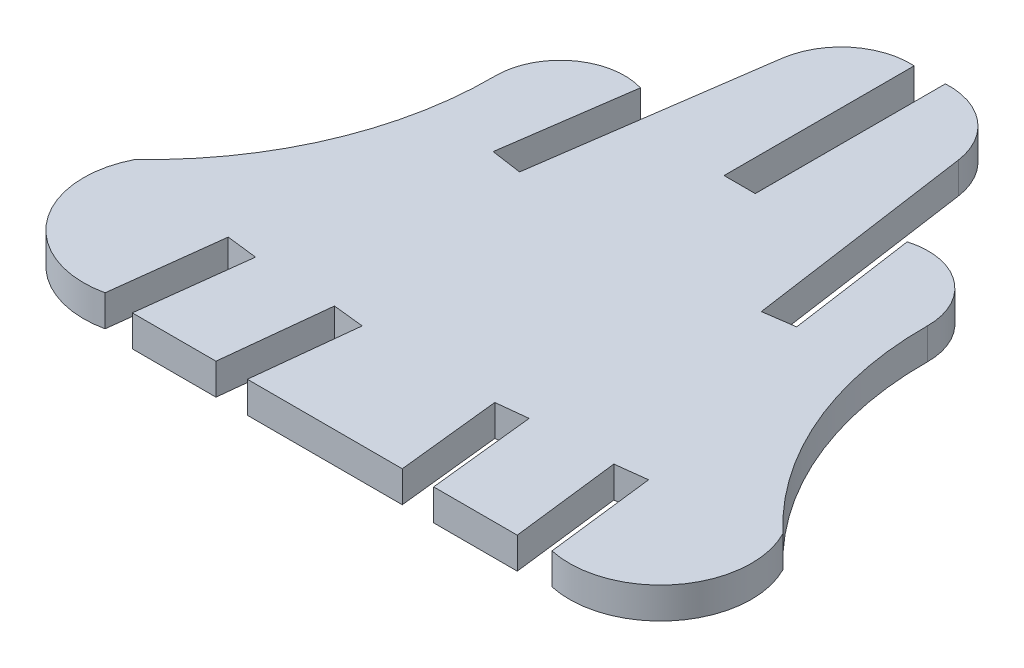
ISO-10303-21;
HEADER;
FILE_DESCRIPTION(('STEP AP214'),'2;1');
FILE_NAME('part.step','',(''),(''),'','','');
FILE_SCHEMA(('AUTOMOTIVE_DESIGN { 1 0 10303 214 1 1 1 1 }'));
ENDSEC;
DATA;
#1=APPLICATION_CONTEXT('core data for automotive mechanical design processes');
#2=APPLICATION_PROTOCOL_DEFINITION('international standard','automotive_design',2000,#1);
#3=PRODUCT_CONTEXT('',#1,'mechanical');
#4=PRODUCT('Part','Part','',(#3));
#5=PRODUCT_RELATED_PRODUCT_CATEGORY('part','',(#4));
#6=PRODUCT_DEFINITION_FORMATION('','',#4);
#7=PRODUCT_DEFINITION_CONTEXT('part definition',#1,'design');
#8=PRODUCT_DEFINITION('design','',#6,#7);
#9=PRODUCT_DEFINITION_SHAPE('','',#8);
#10=(LENGTH_UNIT() NAMED_UNIT(*) SI_UNIT(.MILLI.,.METRE.));
#11=(NAMED_UNIT(*) PLANE_ANGLE_UNIT() SI_UNIT($,.RADIAN.));
#12=(NAMED_UNIT(*) SI_UNIT($,.STERADIAN.) SOLID_ANGLE_UNIT());
#13=UNCERTAINTY_MEASURE_WITH_UNIT(LENGTH_MEASURE(1.E-05),#10,'distance_accuracy_value','');
#14=(GEOMETRIC_REPRESENTATION_CONTEXT(3) GLOBAL_UNCERTAINTY_ASSIGNED_CONTEXT((#13)) GLOBAL_UNIT_ASSIGNED_CONTEXT((#10,
#11,#12)) REPRESENTATION_CONTEXT('',''));
#15=CARTESIAN_POINT('',(0.,0.,0.));
#16=DIRECTION('',(0.,0.,1.));
#17=DIRECTION('',(1.,0.,0.));
#18=AXIS2_PLACEMENT_3D('',#15,#16,#17);
#19=CARTESIAN_POINT('',(-42106.1875,3.,-18178.298828));
#20=DIRECTION('',(-0.992772256153152,0.,0.120013530122983));
#21=DIRECTION('',(0.120013530122983,0.,0.992772256153152));
#22=AXIS2_PLACEMENT_3D('',#19,#20,#21);
#23=PLANE('',#22);
#24=DIRECTION('',(-0.120013530122983,0.,-0.992772256153152));
#25=VECTOR('',#24,1.);
#26=CARTESIAN_POINT('',(-42106.1875,0.,-18178.298828));
#27=LINE('',#26,#25);
#28=CARTESIAN_POINT('',(-42104.910156,0.,-18167.732422));
#29=VERTEX_POINT('',#28);
#30=CARTESIAN_POINT('',(-42106.1875,0.,-18178.298828));
#31=VERTEX_POINT('',#30);
#32=EDGE_CURVE('E275',#29,#31,#27,.T.);
#33=ORIENTED_EDGE('',*,*,#32,.T.);
#34=DIRECTION('',(0.,-1.,0.));
#35=VECTOR('',#34,1.);
#36=CARTESIAN_POINT('',(-42106.1875,3.,-18178.298828));
#37=LINE('',#36,#35);
#38=CARTESIAN_POINT('',(-42106.1875,3.,-18178.298828));
#39=VERTEX_POINT('',#38);
#40=EDGE_CURVE('E11',#39,#31,#37,.T.);
#41=ORIENTED_EDGE('',*,*,#40,.F.);
#42=DIRECTION('',(-0.120013530122983,0.,-0.992772256153152));
#43=VECTOR('',#42,1.);
#44=CARTESIAN_POINT('',(-42106.1875,3.,-18178.298828));
#45=LINE('',#44,#43);
#46=CARTESIAN_POINT('',(-42104.910156,3.,-18167.732422));
#47=VERTEX_POINT('',#46);
#48=EDGE_CURVE('E337',#47,#39,#45,.T.);
#49=ORIENTED_EDGE('',*,*,#48,.F.);
#50=DIRECTION('',(0.,-1.,0.));
#51=VECTOR('',#50,1.);
#52=CARTESIAN_POINT('',(-42104.910156,3.,-18167.732422));
#53=LINE('',#52,#51);
#54=EDGE_CURVE('E271',#47,#29,#53,.T.);
#55=ORIENTED_EDGE('',*,*,#54,.T.);
#56=EDGE_LOOP('',(#33,#41,#49,#55));
#57=FACE_BOUND('',#56,.T.);
#58=ADVANCED_FACE('F35',(#57),#23,.F.);
#59=CARTESIAN_POINT('',(-42103.207031,3.,-18178.660156));
#60=DIRECTION('',(-0.120350744552578,0.,-0.992731433110506));
#61=DIRECTION('',(-0.992731433110507,0.,0.120350744552578));
#62=AXIS2_PLACEMENT_3D('',#59,#60,#61);
#63=PLANE('',#62);
#64=DIRECTION('',(0.992731433110507,0.,-0.120350744552578));
#65=VECTOR('',#64,1.);
#66=CARTESIAN_POINT('',(-42103.207031,0.,-18178.660156));
#67=LINE('',#66,#65);
#68=CARTESIAN_POINT('',(-42103.207031,0.,-18178.660156));
#69=VERTEX_POINT('',#68);
#70=EDGE_CURVE('E278',#31,#69,#67,.T.);
#71=ORIENTED_EDGE('',*,*,#70,.T.);
#72=DIRECTION('',(0.,-1.,0.));
#73=VECTOR('',#72,1.);
#74=CARTESIAN_POINT('',(-42103.207031,3.,-18178.660156));
#75=LINE('',#74,#73);
#76=CARTESIAN_POINT('',(-42103.207031,3.,-18178.660156));
#77=VERTEX_POINT('',#76);
#78=EDGE_CURVE('E43',#77,#69,#75,.T.);
#79=ORIENTED_EDGE('',*,*,#78,.F.);
#80=DIRECTION('',(0.992731433110507,0.,-0.120350744552578));
#81=VECTOR('',#80,1.);
#82=CARTESIAN_POINT('',(-42103.207031,3.,-18178.660156));
#83=LINE('',#82,#81);
#84=EDGE_CURVE('E166',#39,#77,#83,.T.);
#85=ORIENTED_EDGE('',*,*,#84,.F.);
#86=ORIENTED_EDGE('',*,*,#40,.T.);
#87=EDGE_LOOP('',(#71,#79,#85,#86));
#88=FACE_BOUND('',#87,.T.);
#89=ADVANCED_FACE('F515',(#88),#63,.F.);
#90=CARTESIAN_POINT('',(-42101.930163,3.,-18168.091132));
#91=DIRECTION('',(0.992781122721639,0.,-0.119940161612204));
#92=DIRECTION('',(-0.119940161612204,0.,-0.992781122721639));
#93=AXIS2_PLACEMENT_3D('',#90,#91,#92);
#94=PLANE('',#93);
#95=DIRECTION('',(0.119940161612204,0.,0.992781122721639));
#96=VECTOR('',#95,1.);
#97=CARTESIAN_POINT('',(-42101.930163,0.,-18168.091132));
#98=LINE('',#97,#96);
#99=CARTESIAN_POINT('',(-42101.930163,0.,-18168.091132));
#100=VERTEX_POINT('',#99);
#101=EDGE_CURVE('E280',#69,#100,#98,.T.);
#102=ORIENTED_EDGE('',*,*,#101,.T.);
#103=DIRECTION('',(0.,-1.,0.));
#104=VECTOR('',#103,1.);
#105=CARTESIAN_POINT('',(-42101.930163,3.,-18168.091132));
#106=LINE('',#105,#104);
#107=CARTESIAN_POINT('',(-42101.930163,3.,-18168.091132));
#108=VERTEX_POINT('',#107);
#109=EDGE_CURVE('E416',#108,#100,#106,.T.);
#110=ORIENTED_EDGE('',*,*,#109,.F.);
#111=DIRECTION('',(0.119940161612204,0.,0.992781122721639));
#112=VECTOR('',#111,1.);
#113=CARTESIAN_POINT('',(-42101.930163,3.,-18168.091132));
#114=LINE('',#113,#112);
#115=EDGE_CURVE('E424',#77,#108,#114,.T.);
#116=ORIENTED_EDGE('',*,*,#115,.F.);
#117=ORIENTED_EDGE('',*,*,#78,.T.);
#118=EDGE_LOOP('',(#102,#110,#116,#117));
#119=FACE_BOUND('',#118,.T.);
#120=ADVANCED_FACE('F422',(#119),#94,.F.);
#121=CARTESIAN_POINT('',(-42100.0576006114,3.,-18176.6497267105));
#122=DIRECTION('',(0.,-1.,0.));
#123=DIRECTION('',(0.,0.,-1.));
#124=AXIS2_PLACEMENT_3D('',#121,#122,#123);
#125=CYLINDRICAL_SURFACE('',#124,8.76105206681195);
#126=CARTESIAN_POINT('',(-42100.0576006114,0.,-18176.6497267105));
#127=DIRECTION('',(0.,1.,0.));
#128=DIRECTION('',(0.,0.,1.));
#129=AXIS2_PLACEMENT_3D('',#126,#127,#128);
#130=CIRCLE('',#129,8.76105206681195);
#131=CARTESIAN_POINT('',(-42092.260597,0.,-18180.64507));
#132=VERTEX_POINT('',#131);
#133=EDGE_CURVE('E282',#100,#132,#130,.T.);
#134=ORIENTED_EDGE('',*,*,#133,.T.);
#135=DIRECTION('',(0.,-1.,0.));
#136=VECTOR('',#135,1.);
#137=CARTESIAN_POINT('',(-42092.260597,3.,-18180.64507));
#138=LINE('',#137,#136);
#139=CARTESIAN_POINT('',(-42092.260597,3.,-18180.64507));
#140=VERTEX_POINT('',#139);
#141=EDGE_CURVE('E413',#140,#132,#138,.T.);
#142=ORIENTED_EDGE('',*,*,#141,.F.);
#143=CARTESIAN_POINT('',(-42100.0576006114,3.,-18176.6497267105));
#144=DIRECTION('',(0.,1.,0.));
#145=DIRECTION('',(0.,0.,1.));
#146=AXIS2_PLACEMENT_3D('',#143,#144,#145);
#147=CIRCLE('',#146,8.76105206681195);
#148=EDGE_CURVE('E442',#108,#140,#147,.T.);
#149=ORIENTED_EDGE('',*,*,#148,.F.);
#150=ORIENTED_EDGE('',*,*,#109,.T.);
#151=EDGE_LOOP('',(#134,#142,#149,#150));
#152=FACE_BOUND('',#151,.T.);
#153=ADVANCED_FACE('F433',(#152),#125,.T.);
#154=CARTESIAN_POINT('',(-42069.653546331,3.,-18204.6414887281));
#155=DIRECTION('',(0.,-1.,0.));
#156=DIRECTION('',(0.,0.,-1.));
#157=AXIS2_PLACEMENT_3D('',#154,#155,#156);
#158=CYLINDRICAL_SURFACE('',#157,32.9682703781003);
#159=CARTESIAN_POINT('',(-42069.653546331,0.,-18204.6414887281));
#160=DIRECTION('',(0.,-1.,0.));
#161=DIRECTION('',(0.,0.,1.));
#162=AXIS2_PLACEMENT_3D('',#159,#160,#161);
#163=CIRCLE('',#162,32.9682703781003);
#164=CARTESIAN_POINT('',(-42102.620675,0.,-18204.915859));
#165=VERTEX_POINT('',#164);
#166=EDGE_CURVE('E284',#132,#165,#163,.T.);
#167=ORIENTED_EDGE('',*,*,#166,.T.);
#168=DIRECTION('',(0.,-1.,0.));
#169=VECTOR('',#168,1.);
#170=CARTESIAN_POINT('',(-42102.620675,3.,-18204.915859));
#171=LINE('',#170,#169);
#172=CARTESIAN_POINT('',(-42102.620675,3.,-18204.915859));
#173=VERTEX_POINT('',#172);
#174=EDGE_CURVE('E410',#173,#165,#171,.T.);
#175=ORIENTED_EDGE('',*,*,#174,.F.);
#176=CARTESIAN_POINT('',(-42069.653546331,3.,-18204.6414887281));
#177=DIRECTION('',(0.,-1.,0.));
#178=DIRECTION('',(0.,0.,1.));
#179=AXIS2_PLACEMENT_3D('',#176,#177,#178);
#180=CIRCLE('',#179,32.9682703781003);
#181=EDGE_CURVE('E439',#140,#173,#180,.T.);
#182=ORIENTED_EDGE('',*,*,#181,.F.);
#183=ORIENTED_EDGE('',*,*,#141,.T.);
#184=EDGE_LOOP('',(#167,#175,#182,#183));
#185=FACE_BOUND('',#184,.T.);
#186=ADVANCED_FACE('F437',(#185),#158,.F.);
#187=CARTESIAN_POINT('',(-42108.8242526346,3.,-18204.966822316));
#188=DIRECTION('',(0.,-1.,0.));
#189=DIRECTION('',(0.,0.,-1.));
#190=AXIS2_PLACEMENT_3D('',#187,#188,#189);
#191=CYLINDRICAL_SURFACE('',#190,6.20378696669872);
#192=CARTESIAN_POINT('',(-42108.8242526346,0.,-18204.966822316));
#193=DIRECTION('',(0.,1.,0.));
#194=DIRECTION('',(0.,0.,1.));
#195=AXIS2_PLACEMENT_3D('',#192,#193,#194);
#196=CIRCLE('',#195,6.20378696669872);
#197=CARTESIAN_POINT('',(-42110.589844,0.,-18210.914062));
#198=VERTEX_POINT('',#197);
#199=EDGE_CURVE('E286',#165,#198,#196,.T.);
#200=ORIENTED_EDGE('',*,*,#199,.T.);
#201=DIRECTION('',(0.,-1.,0.));
#202=VECTOR('',#201,1.);
#203=CARTESIAN_POINT('',(-42110.589844,3.,-18210.914062));
#204=LINE('',#203,#202);
#205=CARTESIAN_POINT('',(-42110.589844,3.,-18210.914062));
#206=VERTEX_POINT('',#205);
#207=EDGE_CURVE('E407',#206,#198,#204,.T.);
#208=ORIENTED_EDGE('',*,*,#207,.F.);
#209=CARTESIAN_POINT('',(-42108.8242526346,3.,-18204.966822316));
#210=DIRECTION('',(0.,1.,0.));
#211=DIRECTION('',(0.,0.,1.));
#212=AXIS2_PLACEMENT_3D('',#209,#210,#211);
#213=CIRCLE('',#212,6.20378696669872);
#214=EDGE_CURVE('E441',#173,#206,#213,.T.);
#215=ORIENTED_EDGE('',*,*,#214,.F.);
#216=ORIENTED_EDGE('',*,*,#174,.T.);
#217=EDGE_LOOP('',(#200,#208,#215,#216));
#218=FACE_BOUND('',#217,.T.);
#219=ADVANCED_FACE('F528',(#218),#191,.T.);
#220=CARTESIAN_POINT('',(-42108.820312,3.,-18198.515625));
#221=DIRECTION('',(0.989968189775642,0.,-0.141290421587375));
#222=DIRECTION('',(-0.141290421587375,0.,-0.989968189775642));
#223=AXIS2_PLACEMENT_3D('',#220,#221,#222);
#224=PLANE('',#223);
#225=DIRECTION('',(0.141290421587375,0.,0.989968189775642));
#226=VECTOR('',#225,1.);
#227=CARTESIAN_POINT('',(-42108.820312,0.,-18198.515625));
#228=LINE('',#227,#226);
#229=CARTESIAN_POINT('',(-42108.820312,0.,-18198.515625));
#230=VERTEX_POINT('',#229);
#231=EDGE_CURVE('E288',#198,#230,#228,.T.);
#232=ORIENTED_EDGE('',*,*,#231,.T.);
#233=DIRECTION('',(0.,-1.,0.));
#234=VECTOR('',#233,1.);
#235=CARTESIAN_POINT('',(-42108.820312,3.,-18198.515625));
#236=LINE('',#235,#234);
#237=CARTESIAN_POINT('',(-42108.820312,3.,-18198.515625));
#238=VERTEX_POINT('',#237);
#239=EDGE_CURVE('E404',#238,#230,#236,.T.);
#240=ORIENTED_EDGE('',*,*,#239,.F.);
#241=DIRECTION('',(0.141290421587375,0.,0.989968189775642));
#242=VECTOR('',#241,1.);
#243=CARTESIAN_POINT('',(-42108.820312,3.,-18198.515625));
#244=LINE('',#243,#242);
#245=EDGE_CURVE('E444',#206,#238,#244,.T.);
#246=ORIENTED_EDGE('',*,*,#245,.F.);
#247=ORIENTED_EDGE('',*,*,#207,.T.);
#248=EDGE_LOOP('',(#232,#240,#246,#247));
#249=FACE_BOUND('',#248,.T.);
#250=ADVANCED_FACE('F531',(#249),#224,.F.);
#251=CARTESIAN_POINT('',(-42111.792969,3.,-18198.091797));
#252=DIRECTION('',(0.141148085161714,0.,0.989988493900399));
#253=DIRECTION('',(0.9899884939004,0.,-0.141148085161714));
#254=AXIS2_PLACEMENT_3D('',#251,#252,#253);
#255=PLANE('',#254);
#256=DIRECTION('',(-0.9899884939004,0.,0.141148085161714));
#257=VECTOR('',#256,1.);
#258=CARTESIAN_POINT('',(-42111.792969,0.,-18198.091797));
#259=LINE('',#258,#257);
#260=CARTESIAN_POINT('',(-42111.792969,0.,-18198.091797));
#261=VERTEX_POINT('',#260);
#262=EDGE_CURVE('E290',#230,#261,#259,.T.);
#263=ORIENTED_EDGE('',*,*,#262,.T.);
#264=DIRECTION('',(0.,-1.,0.));
#265=VECTOR('',#264,1.);
#266=CARTESIAN_POINT('',(-42111.792969,3.,-18198.091797));
#267=LINE('',#266,#265);
#268=CARTESIAN_POINT('',(-42111.792969,3.,-18198.091797));
#269=VERTEX_POINT('',#268);
#270=EDGE_CURVE('E401',#269,#261,#267,.T.);
#271=ORIENTED_EDGE('',*,*,#270,.F.);
#272=DIRECTION('',(-0.9899884939004,0.,0.141148085161714));
#273=VECTOR('',#272,1.);
#274=CARTESIAN_POINT('',(-42111.792969,3.,-18198.091797));
#275=LINE('',#274,#273);
#276=EDGE_CURVE('E450',#238,#269,#275,.T.);
#277=ORIENTED_EDGE('',*,*,#276,.F.);
#278=ORIENTED_EDGE('',*,*,#239,.T.);
#279=EDGE_LOOP('',(#263,#271,#277,#278));
#280=FACE_BOUND('',#279,.T.);
#281=ADVANCED_FACE('F535',(#280),#255,.F.);
#282=CARTESIAN_POINT('',(-42114.939322,3.,-18220.18568));
#283=DIRECTION('',(-0.990011603966922,0.,0.14098590004267));
#284=DIRECTION('',(0.14098590004267,0.,0.990011603966922));
#285=AXIS2_PLACEMENT_3D('',#282,#283,#284);
#286=PLANE('',#285);
#287=DIRECTION('',(-0.14098590004267,0.,-0.990011603966922));
#288=VECTOR('',#287,1.);
#289=CARTESIAN_POINT('',(-42114.939322,0.,-18220.18568));
#290=LINE('',#289,#288);
#291=CARTESIAN_POINT('',(-42114.939322,0.,-18220.18568));
#292=VERTEX_POINT('',#291);
#293=EDGE_CURVE('E292',#261,#292,#290,.T.);
#294=ORIENTED_EDGE('',*,*,#293,.T.);
#295=DIRECTION('',(0.,-1.,0.));
#296=VECTOR('',#295,1.);
#297=CARTESIAN_POINT('',(-42114.939322,3.,-18220.18568));
#298=LINE('',#297,#296);
#299=CARTESIAN_POINT('',(-42114.939322,3.,-18220.18568));
#300=VERTEX_POINT('',#299);
#301=EDGE_CURVE('E398',#300,#292,#298,.T.);
#302=ORIENTED_EDGE('',*,*,#301,.F.);
#303=DIRECTION('',(-0.14098590004267,0.,-0.990011603966922));
#304=VECTOR('',#303,1.);
#305=CARTESIAN_POINT('',(-42114.939322,3.,-18220.18568));
#306=LINE('',#305,#304);
#307=EDGE_CURVE('E452',#269,#300,#306,.T.);
#308=ORIENTED_EDGE('',*,*,#307,.F.);
#309=ORIENTED_EDGE('',*,*,#270,.T.);
#310=EDGE_LOOP('',(#294,#302,#308,#309));
#311=FACE_BOUND('',#310,.T.);
#312=ADVANCED_FACE('F539',(#311),#286,.F.);
#313=CARTESIAN_POINT('',(-42121.5517199728,3.,-18219.2449121822));
#314=DIRECTION('',(0.,-1.,0.));
#315=DIRECTION('',(0.,0.,-1.));
#316=AXIS2_PLACEMENT_3D('',#313,#314,#315);
#317=CYLINDRICAL_SURFACE('',#316,6.67898577910288);
#318=CARTESIAN_POINT('',(-42121.5517199728,0.,-18219.2449121822));
#319=DIRECTION('',(0.,1.,0.));
#320=DIRECTION('',(0.,0.,1.));
#321=AXIS2_PLACEMENT_3D('',#318,#319,#320);
#322=CIRCLE('',#321,6.67898577910288);
#323=CARTESIAN_POINT('',(-42121.914062,0.,-18225.914062));
#324=VERTEX_POINT('',#323);
#325=EDGE_CURVE('E294',#292,#324,#322,.T.);
#326=ORIENTED_EDGE('',*,*,#325,.T.);
#327=DIRECTION('',(0.,-1.,0.));
#328=VECTOR('',#327,1.);
#329=CARTESIAN_POINT('',(-42121.914062,3.,-18225.914062));
#330=LINE('',#329,#328);
#331=CARTESIAN_POINT('',(-42121.914062,3.,-18225.914062));
#332=VERTEX_POINT('',#331);
#333=EDGE_CURVE('E395',#332,#324,#330,.T.);
#334=ORIENTED_EDGE('',*,*,#333,.F.);
#335=CARTESIAN_POINT('',(-42121.5517199728,3.,-18219.2449121822));
#336=DIRECTION('',(0.,1.,0.));
#337=DIRECTION('',(0.,0.,1.));
#338=AXIS2_PLACEMENT_3D('',#335,#336,#337);
#339=CIRCLE('',#338,6.67898577910288);
#340=EDGE_CURVE('E454',#300,#332,#339,.T.);
#341=ORIENTED_EDGE('',*,*,#340,.F.);
#342=ORIENTED_EDGE('',*,*,#301,.T.);
#343=EDGE_LOOP('',(#326,#334,#341,#342));
#344=FACE_BOUND('',#343,.T.);
#345=ADVANCED_FACE('F543',(#344),#317,.T.);
#346=CARTESIAN_POINT('',(-42121.914062,3.,-18207.628906));
#347=DIRECTION('',(1.,0.,-1.94294961377129E-12));
#348=DIRECTION('',(-1.94294961377129E-12,0.,-1.));
#349=AXIS2_PLACEMENT_3D('',#346,#347,#348);
#350=PLANE('',#349);
#351=DIRECTION('',(1.94294961377129E-12,0.,1.));
#352=VECTOR('',#351,1.);
#353=CARTESIAN_POINT('',(-42121.914062,0.,-18207.628906));
#354=LINE('',#353,#352);
#355=CARTESIAN_POINT('',(-42121.914062,0.,-18207.628906));
#356=VERTEX_POINT('',#355);
#357=EDGE_CURVE('E296',#324,#356,#354,.T.);
#358=ORIENTED_EDGE('',*,*,#357,.T.);
#359=DIRECTION('',(0.,-1.,0.));
#360=VECTOR('',#359,1.);
#361=CARTESIAN_POINT('',(-42121.914062,3.,-18207.628906));
#362=LINE('',#361,#360);
#363=CARTESIAN_POINT('',(-42121.914062,3.,-18207.628906));
#364=VERTEX_POINT('',#363);
#365=EDGE_CURVE('E392',#364,#356,#362,.T.);
#366=ORIENTED_EDGE('',*,*,#365,.F.);
#367=DIRECTION('',(1.94294961377129E-12,0.,1.));
#368=VECTOR('',#367,1.);
#369=CARTESIAN_POINT('',(-42121.914062,3.,-18207.628906));
#370=LINE('',#369,#368);
#371=EDGE_CURVE('E456',#332,#364,#370,.T.);
#372=ORIENTED_EDGE('',*,*,#371,.F.);
#373=ORIENTED_EDGE('',*,*,#333,.T.);
#374=EDGE_LOOP('',(#358,#366,#372,#373));
#375=FACE_BOUND('',#374,.T.);
#376=ADVANCED_FACE('F547',(#375),#350,.F.);
#377=CARTESIAN_POINT('',(-42124.917969,3.,-18207.628906));
#378=DIRECTION('',(0.,0.,1.));
#379=DIRECTION('',(1.,0.,0.));
#380=AXIS2_PLACEMENT_3D('',#377,#378,#379);
#381=PLANE('',#380);
#382=DIRECTION('',(-1.,0.,0.));
#383=VECTOR('',#382,1.);
#384=CARTESIAN_POINT('',(-42124.917969,0.,-18207.628906));
#385=LINE('',#384,#383);
#386=CARTESIAN_POINT('',(-42124.917969,0.,-18207.628906));
#387=VERTEX_POINT('',#386);
#388=EDGE_CURVE('E298',#356,#387,#385,.T.);
#389=ORIENTED_EDGE('',*,*,#388,.T.);
#390=DIRECTION('',(0.,-1.,0.));
#391=VECTOR('',#390,1.);
#392=CARTESIAN_POINT('',(-42124.917969,3.,-18207.628906));
#393=LINE('',#392,#391);
#394=CARTESIAN_POINT('',(-42124.917969,3.,-18207.628906));
#395=VERTEX_POINT('',#394);
#396=EDGE_CURVE('E389',#395,#387,#393,.T.);
#397=ORIENTED_EDGE('',*,*,#396,.F.);
#398=DIRECTION('',(-1.,0.,0.));
#399=VECTOR('',#398,1.);
#400=CARTESIAN_POINT('',(-42124.917969,3.,-18207.628906));
#401=LINE('',#400,#399);
#402=EDGE_CURVE('E458',#364,#395,#401,.T.);
#403=ORIENTED_EDGE('',*,*,#402,.F.);
#404=ORIENTED_EDGE('',*,*,#365,.T.);
#405=EDGE_LOOP('',(#389,#397,#403,#404));
#406=FACE_BOUND('',#405,.T.);
#407=ADVANCED_FACE('F551',(#406),#381,.F.);
#408=CARTESIAN_POINT('',(-42124.913957,3.,-18225.910244));
#409=DIRECTION('',(-0.999999975918925,0.,-0.000219458764930374));
#410=DIRECTION('',(-0.000219458764930374,0.,0.999999975918925));
#411=AXIS2_PLACEMENT_3D('',#408,#409,#410);
#412=PLANE('',#411);
#413=DIRECTION('',(0.000219458764930374,0.,-0.999999975918925));
#414=VECTOR('',#413,1.);
#415=CARTESIAN_POINT('',(-42124.913957,0.,-18225.910244));
#416=LINE('',#415,#414);
#417=CARTESIAN_POINT('',(-42124.913957,0.,-18225.910244));
#418=VERTEX_POINT('',#417);
#419=EDGE_CURVE('E300',#387,#418,#416,.T.);
#420=ORIENTED_EDGE('',*,*,#419,.T.);
#421=DIRECTION('',(0.,-1.,0.));
#422=VECTOR('',#421,1.);
#423=CARTESIAN_POINT('',(-42124.913957,3.,-18225.910244));
#424=LINE('',#423,#422);
#425=CARTESIAN_POINT('',(-42124.913957,3.,-18225.910244));
#426=VERTEX_POINT('',#425);
#427=EDGE_CURVE('E386',#426,#418,#424,.T.);
#428=ORIENTED_EDGE('',*,*,#427,.F.);
#429=DIRECTION('',(0.000219458764930374,0.,-0.999999975918925));
#430=VECTOR('',#429,1.);
#431=CARTESIAN_POINT('',(-42124.913957,3.,-18225.910244));
#432=LINE('',#431,#430);
#433=EDGE_CURVE('E460',#395,#426,#432,.T.);
#434=ORIENTED_EDGE('',*,*,#433,.F.);
#435=ORIENTED_EDGE('',*,*,#396,.T.);
#436=EDGE_LOOP('',(#420,#428,#434,#435));
#437=FACE_BOUND('',#436,.T.);
#438=ADVANCED_FACE('F555',(#437),#412,.F.);
#439=CARTESIAN_POINT('',(-42125.2848004663,3.,-18219.2392779203));
#440=DIRECTION('',(0.,-1.,0.));
#441=DIRECTION('',(0.,0.,-1.));
#442=AXIS2_PLACEMENT_3D('',#439,#440,#441);
#443=CYLINDRICAL_SURFACE('',#442,6.68126584659676);
#444=CARTESIAN_POINT('',(-42125.2848004663,0.,-18219.2392779203));
#445=DIRECTION('',(0.,1.,0.));
#446=DIRECTION('',(0.,0.,1.));
#447=AXIS2_PLACEMENT_3D('',#444,#445,#446);
#448=CIRCLE('',#447,6.68126584659676);
#449=CARTESIAN_POINT('',(-42131.898437,0.,-18220.1875));
#450=VERTEX_POINT('',#449);
#451=EDGE_CURVE('E302',#418,#450,#448,.T.);
#452=ORIENTED_EDGE('',*,*,#451,.T.);
#453=DIRECTION('',(0.,-1.,0.));
#454=VECTOR('',#453,1.);
#455=CARTESIAN_POINT('',(-42131.898437,3.,-18220.1875));
#456=LINE('',#455,#454);
#457=CARTESIAN_POINT('',(-42131.898437,3.,-18220.1875));
#458=VERTEX_POINT('',#457);
#459=EDGE_CURVE('E383',#458,#450,#456,.T.);
#460=ORIENTED_EDGE('',*,*,#459,.F.);
#461=CARTESIAN_POINT('',(-42125.2848004663,3.,-18219.2392779203));
#462=DIRECTION('',(0.,1.,0.));
#463=DIRECTION('',(0.,0.,1.));
#464=AXIS2_PLACEMENT_3D('',#461,#462,#463);
#465=CIRCLE('',#464,6.68126584659676);
#466=EDGE_CURVE('E462',#426,#458,#465,.T.);
#467=ORIENTED_EDGE('',*,*,#466,.F.);
#468=ORIENTED_EDGE('',*,*,#427,.T.);
#469=EDGE_LOOP('',(#452,#460,#467,#468));
#470=FACE_BOUND('',#469,.T.);
#471=ADVANCED_FACE('F559',(#470),#443,.T.);
#472=CARTESIAN_POINT('',(-42135.050781,3.,-18198.097656));
#473=DIRECTION('',(0.989970488727676,0.,0.14127431276876));
#474=DIRECTION('',(0.14127431276876,0.,-0.989970488727677));
#475=AXIS2_PLACEMENT_3D('',#472,#473,#474);
#476=PLANE('',#475);
#477=DIRECTION('',(-0.14127431276876,0.,0.989970488727677));
#478=VECTOR('',#477,1.);
#479=CARTESIAN_POINT('',(-42135.050781,0.,-18198.097656));
#480=LINE('',#479,#478);
#481=CARTESIAN_POINT('',(-42135.050781,0.,-18198.097656));
#482=VERTEX_POINT('',#481);
#483=EDGE_CURVE('E304',#450,#482,#480,.T.);
#484=ORIENTED_EDGE('',*,*,#483,.T.);
#485=DIRECTION('',(0.,-1.,0.));
#486=VECTOR('',#485,1.);
#487=CARTESIAN_POINT('',(-42135.050781,3.,-18198.097656));
#488=LINE('',#487,#486);
#489=CARTESIAN_POINT('',(-42135.050781,3.,-18198.097656));
#490=VERTEX_POINT('',#489);
#491=EDGE_CURVE('E380',#490,#482,#488,.T.);
#492=ORIENTED_EDGE('',*,*,#491,.F.);
#493=DIRECTION('',(-0.14127431276876,0.,0.989970488727677));
#494=VECTOR('',#493,1.);
#495=CARTESIAN_POINT('',(-42135.050781,3.,-18198.097656));
#496=LINE('',#495,#494);
#497=EDGE_CURVE('E464',#458,#490,#496,.T.);
#498=ORIENTED_EDGE('',*,*,#497,.F.);
#499=ORIENTED_EDGE('',*,*,#459,.T.);
#500=EDGE_LOOP('',(#484,#492,#498,#499));
#501=FACE_BOUND('',#500,.T.);
#502=ADVANCED_FACE('F563',(#501),#476,.F.);
#503=CARTESIAN_POINT('',(-42138.015625,3.,-18198.519531));
#504=DIRECTION('',(-0.14087348157636,0.,0.99002760678102));
#505=DIRECTION('',(0.990027606781021,0.,0.14087348157636));
#506=AXIS2_PLACEMENT_3D('',#503,#504,#505);
#507=PLANE('',#506);
#508=DIRECTION('',(-0.99002760678102,0.,-0.14087348157636));
#509=VECTOR('',#508,1.);
#510=CARTESIAN_POINT('',(-42138.015625,0.,-18198.519531));
#511=LINE('',#510,#509);
#512=CARTESIAN_POINT('',(-42138.015625,0.,-18198.519531));
#513=VERTEX_POINT('',#512);
#514=EDGE_CURVE('E306',#482,#513,#511,.T.);
#515=ORIENTED_EDGE('',*,*,#514,.T.);
#516=DIRECTION('',(0.,-1.,0.));
#517=VECTOR('',#516,1.);
#518=CARTESIAN_POINT('',(-42138.015625,3.,-18198.519531));
#519=LINE('',#518,#517);
#520=CARTESIAN_POINT('',(-42138.015625,3.,-18198.519531));
#521=VERTEX_POINT('',#520);
#522=EDGE_CURVE('E377',#521,#513,#519,.T.);
#523=ORIENTED_EDGE('',*,*,#522,.F.);
#524=DIRECTION('',(-0.99002760678102,0.,-0.14087348157636));
#525=VECTOR('',#524,1.);
#526=CARTESIAN_POINT('',(-42138.015625,3.,-18198.519531));
#527=LINE('',#526,#525);
#528=EDGE_CURVE('E466',#490,#521,#527,.T.);
#529=ORIENTED_EDGE('',*,*,#528,.F.);
#530=ORIENTED_EDGE('',*,*,#491,.T.);
#531=EDGE_LOOP('',(#515,#523,#529,#530));
#532=FACE_BOUND('',#531,.T.);
#533=ADVANCED_FACE('F567',(#532),#507,.F.);
#534=CARTESIAN_POINT('',(-42136.245428,3.,-18210.9165379999));
#535=DIRECTION('',(-0.989958480099477,0.,-0.141358436886993));
#536=DIRECTION('',(-0.141358436886993,0.,0.989958480099477));
#537=AXIS2_PLACEMENT_3D('',#534,#535,#536);
#538=PLANE('',#537);
#539=DIRECTION('',(0.141358436886993,0.,-0.989958480099477));
#540=VECTOR('',#539,1.);
#541=CARTESIAN_POINT('',(-42136.245428,0.,-18210.9165379999));
#542=LINE('',#541,#540);
#543=CARTESIAN_POINT('',(-42136.245428,0.,-18210.9165379999));
#544=VERTEX_POINT('',#543);
#545=EDGE_CURVE('E308',#513,#544,#542,.T.);
#546=ORIENTED_EDGE('',*,*,#545,.T.);
#547=DIRECTION('',(0.,-1.,0.));
#548=VECTOR('',#547,1.);
#549=CARTESIAN_POINT('',(-42136.245428,3.,-18210.9165379999));
#550=LINE('',#549,#548);
#551=CARTESIAN_POINT('',(-42136.245428,3.,-18210.9165379999));
#552=VERTEX_POINT('',#551);
#553=EDGE_CURVE('E374',#552,#544,#550,.T.);
#554=ORIENTED_EDGE('',*,*,#553,.F.);
#555=DIRECTION('',(0.141358436886993,0.,-0.989958480099477));
#556=VECTOR('',#555,1.);
#557=CARTESIAN_POINT('',(-42136.245428,3.,-18210.9165379999));
#558=LINE('',#557,#556);
#559=EDGE_CURVE('E468',#521,#552,#558,.T.);
#560=ORIENTED_EDGE('',*,*,#559,.F.);
#561=ORIENTED_EDGE('',*,*,#522,.T.);
#562=EDGE_LOOP('',(#546,#554,#560,#561));
#563=FACE_BOUND('',#562,.T.);
#564=ADVANCED_FACE('F571',(#563),#538,.F.);
#565=CARTESIAN_POINT('',(-42138.0148697885,3.,-18204.9712709502));
#566=DIRECTION('',(0.,-1.,0.));
#567=DIRECTION('',(0.,0.,-1.));
#568=AXIS2_PLACEMENT_3D('',#565,#566,#567);
#569=CYLINDRICAL_SURFACE('',#568,6.20299319161719);
#570=CARTESIAN_POINT('',(-42138.0148697885,0.,-18204.9712709502));
#571=DIRECTION('',(0.,1.,0.));
#572=DIRECTION('',(0.,0.,1.));
#573=AXIS2_PLACEMENT_3D('',#570,#571,#572);
#574=CIRCLE('',#573,6.20299319161719);
#575=CARTESIAN_POINT('',(-42144.21766,0.,-18204.9210900001));
#576=VERTEX_POINT('',#575);
#577=EDGE_CURVE('E310',#544,#576,#574,.T.);
#578=ORIENTED_EDGE('',*,*,#577,.T.);
#579=DIRECTION('',(0.,-1.,0.));
#580=VECTOR('',#579,1.);
#581=CARTESIAN_POINT('',(-42144.21766,3.,-18204.9210900001));
#582=LINE('',#581,#580);
#583=CARTESIAN_POINT('',(-42144.21766,3.,-18204.9210900001));
#584=VERTEX_POINT('',#583);
#585=EDGE_CURVE('E371',#584,#576,#582,.T.);
#586=ORIENTED_EDGE('',*,*,#585,.F.);
#587=CARTESIAN_POINT('',(-42138.0148697885,3.,-18204.9712709502));
#588=DIRECTION('',(0.,1.,0.));
#589=DIRECTION('',(0.,0.,1.));
#590=AXIS2_PLACEMENT_3D('',#587,#588,#589);
#591=CIRCLE('',#590,6.20299319161719);
#592=EDGE_CURVE('E470',#552,#584,#591,.T.);
#593=ORIENTED_EDGE('',*,*,#592,.F.);
#594=ORIENTED_EDGE('',*,*,#553,.T.);
#595=EDGE_LOOP('',(#578,#586,#593,#594));
#596=FACE_BOUND('',#595,.T.);
#597=ADVANCED_FACE('F575',(#596),#569,.T.);
#598=CARTESIAN_POINT('',(-42177.1833561963,3.,-18204.6509479385));
#599=DIRECTION('',(0.,-1.,0.));
#600=DIRECTION('',(0.,0.,-1.));
#601=AXIS2_PLACEMENT_3D('',#598,#599,#600);
#602=CYLINDRICAL_SURFACE('',#601,32.9668030364034);
#603=CARTESIAN_POINT('',(-42177.1833561963,0.,-18204.6509479385));
#604=DIRECTION('',(0.,-1.,0.));
#605=DIRECTION('',(0.,0.,1.));
#606=AXIS2_PLACEMENT_3D('',#603,#604,#605);
#607=CIRCLE('',#606,32.9668030364034);
#608=CARTESIAN_POINT('',(-42154.5795199999,0.,-18180.653517));
#609=VERTEX_POINT('',#608);
#610=EDGE_CURVE('E312',#576,#609,#607,.T.);
#611=ORIENTED_EDGE('',*,*,#610,.T.);
#612=DIRECTION('',(0.,-1.,0.));
#613=VECTOR('',#612,1.);
#614=CARTESIAN_POINT('',(-42154.5795199999,3.,-18180.653517));
#615=LINE('',#614,#613);
#616=CARTESIAN_POINT('',(-42154.5795199999,3.,-18180.653517));
#617=VERTEX_POINT('',#616);
#618=EDGE_CURVE('E368',#617,#609,#615,.T.);
#619=ORIENTED_EDGE('',*,*,#618,.F.);
#620=CARTESIAN_POINT('',(-42177.1833561963,3.,-18204.6509479385));
#621=DIRECTION('',(0.,-1.,0.));
#622=DIRECTION('',(0.,0.,1.));
#623=AXIS2_PLACEMENT_3D('',#620,#621,#622);
#624=CIRCLE('',#623,32.9668030364034);
#625=EDGE_CURVE('E472',#584,#617,#624,.T.);
#626=ORIENTED_EDGE('',*,*,#625,.F.);
#627=ORIENTED_EDGE('',*,*,#585,.T.);
#628=EDGE_LOOP('',(#611,#619,#626,#627));
#629=FACE_BOUND('',#628,.T.);
#630=ADVANCED_FACE('F579',(#629),#602,.F.);
#631=CARTESIAN_POINT('',(-42146.7850469702,3.,-18176.6561083083));
#632=DIRECTION('',(0.,-1.,0.));
#633=DIRECTION('',(0.,0.,-1.));
#634=AXIS2_PLACEMENT_3D('',#631,#632,#633);
#635=CYLINDRICAL_SURFACE('',#634,8.75974235120112);
#636=CARTESIAN_POINT('',(-42146.7850469702,0.,-18176.6561083083));
#637=DIRECTION('',(0.,1.,0.));
#638=DIRECTION('',(0.,0.,1.));
#639=AXIS2_PLACEMENT_3D('',#636,#637,#638);
#640=CIRCLE('',#639,8.75974235120112);
#641=CARTESIAN_POINT('',(-42144.917969,0.,-18168.0976560001));
#642=VERTEX_POINT('',#641);
#643=EDGE_CURVE('E314',#609,#642,#640,.T.);
#644=ORIENTED_EDGE('',*,*,#643,.T.);
#645=DIRECTION('',(0.,-1.,0.));
#646=VECTOR('',#645,1.);
#647=CARTESIAN_POINT('',(-42144.917969,3.,-18168.0976560001));
#648=LINE('',#647,#646);
#649=CARTESIAN_POINT('',(-42144.917969,3.,-18168.0976560001));
#650=VERTEX_POINT('',#649);
#651=EDGE_CURVE('E365',#650,#642,#648,.T.);
#652=ORIENTED_EDGE('',*,*,#651,.F.);
#653=CARTESIAN_POINT('',(-42146.7850469702,3.,-18176.6561083083));
#654=DIRECTION('',(0.,1.,0.));
#655=DIRECTION('',(0.,0.,1.));
#656=AXIS2_PLACEMENT_3D('',#653,#654,#655);
#657=CIRCLE('',#656,8.75974235120112);
#658=EDGE_CURVE('E474',#617,#650,#657,.T.);
#659=ORIENTED_EDGE('',*,*,#658,.F.);
#660=ORIENTED_EDGE('',*,*,#618,.T.);
#661=EDGE_LOOP('',(#644,#652,#659,#660));
#662=FACE_BOUND('',#661,.T.);
#663=ADVANCED_FACE('F583',(#662),#635,.T.);
#664=CARTESIAN_POINT('',(-42143.636719,3.,-18178.662109));
#665=DIRECTION('',(-0.992725807244368,0.,-0.120397141290885));
#666=DIRECTION('',(-0.120397141290885,0.,0.992725807244368));
#667=AXIS2_PLACEMENT_3D('',#664,#665,#666);
#668=PLANE('',#667);
#669=DIRECTION('',(0.120397141290885,0.,-0.992725807244368));
#670=VECTOR('',#669,1.);
#671=CARTESIAN_POINT('',(-42143.636719,0.,-18178.662109));
#672=LINE('',#671,#670);
#673=CARTESIAN_POINT('',(-42143.636719,0.,-18178.662109));
#674=VERTEX_POINT('',#673);
#675=EDGE_CURVE('E316',#642,#674,#672,.T.);
#676=ORIENTED_EDGE('',*,*,#675,.T.);
#677=DIRECTION('',(0.,-1.,0.));
#678=VECTOR('',#677,1.);
#679=CARTESIAN_POINT('',(-42143.636719,3.,-18178.662109));
#680=LINE('',#679,#678);
#681=CARTESIAN_POINT('',(-42143.636719,3.,-18178.662109));
#682=VERTEX_POINT('',#681);
#683=EDGE_CURVE('E362',#682,#674,#680,.T.);
#684=ORIENTED_EDGE('',*,*,#683,.F.);
#685=DIRECTION('',(0.120397141290885,0.,-0.992725807244368));
#686=VECTOR('',#685,1.);
#687=CARTESIAN_POINT('',(-42143.636719,3.,-18178.662109));
#688=LINE('',#687,#686);
#689=EDGE_CURVE('E476',#650,#682,#688,.T.);
#690=ORIENTED_EDGE('',*,*,#689,.F.);
#691=ORIENTED_EDGE('',*,*,#651,.T.);
#692=EDGE_LOOP('',(#676,#684,#690,#691));
#693=FACE_BOUND('',#692,.T.);
#694=ADVANCED_FACE('F587',(#693),#668,.F.);
#695=CARTESIAN_POINT('',(-42140.65625,3.,-18178.302734));
#696=DIRECTION('',(0.11970958832167,0.,-0.992808951643697));
#697=DIRECTION('',(-0.992808951643697,0.,-0.11970958832167));
#698=AXIS2_PLACEMENT_3D('',#695,#696,#697);
#699=PLANE('',#698);
#700=DIRECTION('',(0.992808951643697,0.,0.11970958832167));
#701=VECTOR('',#700,1.);
#702=CARTESIAN_POINT('',(-42140.65625,0.,-18178.302734));
#703=LINE('',#702,#701);
#704=CARTESIAN_POINT('',(-42140.65625,0.,-18178.302734));
#705=VERTEX_POINT('',#704);
#706=EDGE_CURVE('E318',#674,#705,#703,.T.);
#707=ORIENTED_EDGE('',*,*,#706,.T.);
#708=DIRECTION('',(0.,-1.,0.));
#709=VECTOR('',#708,1.);
#710=CARTESIAN_POINT('',(-42140.65625,3.,-18178.302734));
#711=LINE('',#710,#709);
#712=CARTESIAN_POINT('',(-42140.65625,3.,-18178.302734));
#713=VERTEX_POINT('',#712);
#714=EDGE_CURVE('E359',#713,#705,#711,.T.);
#715=ORIENTED_EDGE('',*,*,#714,.F.);
#716=DIRECTION('',(0.992808951643697,0.,0.11970958832167));
#717=VECTOR('',#716,1.);
#718=CARTESIAN_POINT('',(-42140.65625,3.,-18178.302734));
#719=LINE('',#718,#717);
#720=EDGE_CURVE('E478',#682,#713,#719,.T.);
#721=ORIENTED_EDGE('',*,*,#720,.F.);
#722=ORIENTED_EDGE('',*,*,#683,.T.);
#723=EDGE_LOOP('',(#707,#715,#721,#722));
#724=FACE_BOUND('',#723,.T.);
#725=ADVANCED_FACE('F591',(#724),#699,.F.);
#726=CARTESIAN_POINT('',(-42141.9375,3.,-18167.736328));
#727=DIRECTION('',(0.992728466733184,0.,0.120375210643974));
#728=DIRECTION('',(0.120375210643974,0.,-0.992728466733184));
#729=AXIS2_PLACEMENT_3D('',#726,#727,#728);
#730=PLANE('',#729);
#731=DIRECTION('',(-0.120375210643974,0.,0.992728466733184));
#732=VECTOR('',#731,1.);
#733=CARTESIAN_POINT('',(-42141.9375,0.,-18167.736328));
#734=LINE('',#733,#732);
#735=CARTESIAN_POINT('',(-42141.9375,0.,-18167.736328));
#736=VERTEX_POINT('',#735);
#737=EDGE_CURVE('E320',#705,#736,#734,.T.);
#738=ORIENTED_EDGE('',*,*,#737,.T.);
#739=DIRECTION('',(0.,-1.,0.));
#740=VECTOR('',#739,1.);
#741=CARTESIAN_POINT('',(-42141.9375,3.,-18167.736328));
#742=LINE('',#741,#740);
#743=CARTESIAN_POINT('',(-42141.9375,3.,-18167.736328));
#744=VERTEX_POINT('',#743);
#745=EDGE_CURVE('E356',#744,#736,#742,.T.);
#746=ORIENTED_EDGE('',*,*,#745,.F.);
#747=DIRECTION('',(-0.120375210643974,0.,0.992728466733184));
#748=VECTOR('',#747,1.);
#749=CARTESIAN_POINT('',(-42141.9375,3.,-18167.736328));
#750=LINE('',#749,#748);
#751=EDGE_CURVE('E480',#713,#744,#750,.T.);
#752=ORIENTED_EDGE('',*,*,#751,.F.);
#753=ORIENTED_EDGE('',*,*,#714,.T.);
#754=EDGE_LOOP('',(#738,#746,#752,#753));
#755=FACE_BOUND('',#754,.T.);
#756=ADVANCED_FACE('F595',(#755),#730,.F.);
#757=CARTESIAN_POINT('',(-42133.890625,3.,-18167.734375));
#758=DIRECTION('',(0.000242702905245472,0.,-0.999999970547649));
#759=DIRECTION('',(-0.999999970547649,0.,-0.000242702905245472));
#760=AXIS2_PLACEMENT_3D('',#757,#758,#759);
#761=PLANE('',#760);
#762=DIRECTION('',(0.999999970547649,0.,0.000242702905245472));
#763=VECTOR('',#762,1.);
#764=CARTESIAN_POINT('',(-42133.890625,0.,-18167.734375));
#765=LINE('',#764,#763);
#766=CARTESIAN_POINT('',(-42133.890625,0.,-18167.734375));
#767=VERTEX_POINT('',#766);
#768=EDGE_CURVE('E322',#736,#767,#765,.T.);
#769=ORIENTED_EDGE('',*,*,#768,.T.);
#770=DIRECTION('',(0.,-1.,0.));
#771=VECTOR('',#770,1.);
#772=CARTESIAN_POINT('',(-42133.890625,3.,-18167.734375));
#773=LINE('',#772,#771);
#774=CARTESIAN_POINT('',(-42133.890625,3.,-18167.734375));
#775=VERTEX_POINT('',#774);
#776=EDGE_CURVE('E353',#775,#767,#773,.T.);
#777=ORIENTED_EDGE('',*,*,#776,.F.);
#778=DIRECTION('',(0.999999970547649,0.,0.000242702905245472));
#779=VECTOR('',#778,1.);
#780=CARTESIAN_POINT('',(-42133.890625,3.,-18167.734375));
#781=LINE('',#780,#779);
#782=EDGE_CURVE('E482',#744,#775,#781,.T.);
#783=ORIENTED_EDGE('',*,*,#782,.F.);
#784=ORIENTED_EDGE('',*,*,#745,.T.);
#785=EDGE_LOOP('',(#769,#777,#783,#784));
#786=FACE_BOUND('',#785,.T.);
#787=ADVANCED_FACE('F599',(#786),#761,.F.);
#788=CARTESIAN_POINT('',(-42132.785156,3.,-18178.029297));
#789=DIRECTION('',(-0.994284147550565,0.,-0.106766258385529));
#790=DIRECTION('',(-0.106766258385529,0.,0.994284147550565));
#791=AXIS2_PLACEMENT_3D('',#788,#789,#790);
#792=PLANE('',#791);
#793=DIRECTION('',(0.106766258385529,0.,-0.994284147550565));
#794=VECTOR('',#793,1.);
#795=CARTESIAN_POINT('',(-42132.785156,0.,-18178.029297));
#796=LINE('',#795,#794);
#797=CARTESIAN_POINT('',(-42132.785156,0.,-18178.029297));
#798=VERTEX_POINT('',#797);
#799=EDGE_CURVE('E324',#767,#798,#796,.T.);
#800=ORIENTED_EDGE('',*,*,#799,.T.);
#801=DIRECTION('',(0.,-1.,0.));
#802=VECTOR('',#801,1.);
#803=CARTESIAN_POINT('',(-42132.785156,3.,-18178.029297));
#804=LINE('',#803,#802);
#805=CARTESIAN_POINT('',(-42132.785156,3.,-18178.029297));
#806=VERTEX_POINT('',#805);
#807=EDGE_CURVE('E350',#806,#798,#804,.T.);
#808=ORIENTED_EDGE('',*,*,#807,.F.);
#809=DIRECTION('',(0.106766258385529,0.,-0.994284147550565));
#810=VECTOR('',#809,1.);
#811=CARTESIAN_POINT('',(-42132.785156,3.,-18178.029297));
#812=LINE('',#811,#810);
#813=EDGE_CURVE('E484',#775,#806,#812,.T.);
#814=ORIENTED_EDGE('',*,*,#813,.F.);
#815=ORIENTED_EDGE('',*,*,#776,.T.);
#816=EDGE_LOOP('',(#800,#808,#814,#815));
#817=FACE_BOUND('',#816,.T.);
#818=ADVANCED_FACE('F603',(#817),#792,.F.);
#819=CARTESIAN_POINT('',(-42129.796875,3.,-18177.705078));
#820=DIRECTION('',(0.107863819415371,0.,-0.994165678577333));
#821=DIRECTION('',(-0.994165678577333,0.,-0.107863819415371));
#822=AXIS2_PLACEMENT_3D('',#819,#820,#821);
#823=PLANE('',#822);
#824=DIRECTION('',(0.994165678577333,0.,0.107863819415371));
#825=VECTOR('',#824,1.);
#826=CARTESIAN_POINT('',(-42129.796875,0.,-18177.705078));
#827=LINE('',#826,#825);
#828=CARTESIAN_POINT('',(-42129.796875,0.,-18177.705078));
#829=VERTEX_POINT('',#828);
#830=EDGE_CURVE('E326',#798,#829,#827,.T.);
#831=ORIENTED_EDGE('',*,*,#830,.T.);
#832=DIRECTION('',(0.,-1.,0.));
#833=VECTOR('',#832,1.);
#834=CARTESIAN_POINT('',(-42129.796875,3.,-18177.705078));
#835=LINE('',#834,#833);
#836=CARTESIAN_POINT('',(-42129.796875,3.,-18177.705078));
#837=VERTEX_POINT('',#836);
#838=EDGE_CURVE('E347',#837,#829,#835,.T.);
#839=ORIENTED_EDGE('',*,*,#838,.F.);
#840=DIRECTION('',(0.994165678577333,0.,0.107863819415371));
#841=VECTOR('',#840,1.);
#842=CARTESIAN_POINT('',(-42129.796875,3.,-18177.705078));
#843=LINE('',#842,#841);
#844=EDGE_CURVE('E486',#806,#837,#843,.T.);
#845=ORIENTED_EDGE('',*,*,#844,.F.);
#846=ORIENTED_EDGE('',*,*,#807,.T.);
#847=EDGE_LOOP('',(#831,#839,#845,#846));
#848=FACE_BOUND('',#847,.T.);
#849=ADVANCED_FACE('F607',(#848),#823,.F.);
#850=CARTESIAN_POINT('',(-42130.875,3.,-18167.738281));
#851=DIRECTION('',(0.994200293634002,0.,0.107544298491667));
#852=DIRECTION('',(0.107544298491667,0.,-0.994200293634002));
#853=AXIS2_PLACEMENT_3D('',#850,#851,#852);
#854=PLANE('',#853);
#855=DIRECTION('',(-0.107544298491667,0.,0.994200293634002));
#856=VECTOR('',#855,1.);
#857=CARTESIAN_POINT('',(-42130.875,0.,-18167.738281));
#858=LINE('',#857,#856);
#859=CARTESIAN_POINT('',(-42130.875,0.,-18167.738281));
#860=VERTEX_POINT('',#859);
#861=EDGE_CURVE('E328',#829,#860,#858,.T.);
#862=ORIENTED_EDGE('',*,*,#861,.T.);
#863=DIRECTION('',(0.,-1.,0.));
#864=VECTOR('',#863,1.);
#865=CARTESIAN_POINT('',(-42130.875,3.,-18167.738281));
#866=LINE('',#865,#864);
#867=CARTESIAN_POINT('',(-42130.875,3.,-18167.738281));
#868=VERTEX_POINT('',#867);
#869=EDGE_CURVE('E344',#868,#860,#866,.T.);
#870=ORIENTED_EDGE('',*,*,#869,.F.);
#871=DIRECTION('',(-0.107544298491667,0.,0.994200293634002));
#872=VECTOR('',#871,1.);
#873=CARTESIAN_POINT('',(-42130.875,3.,-18167.738281));
#874=LINE('',#873,#872);
#875=EDGE_CURVE('E488',#837,#868,#874,.T.);
#876=ORIENTED_EDGE('',*,*,#875,.F.);
#877=ORIENTED_EDGE('',*,*,#838,.T.);
#878=EDGE_LOOP('',(#862,#870,#876,#877));
#879=FACE_BOUND('',#878,.T.);
#880=ADVANCED_FACE('F611',(#879),#854,.F.);
#881=CARTESIAN_POINT('',(-42115.96875,3.,-18167.732422));
#882=DIRECTION('',(0.000393056573518963,0.,-0.999999922753262));
#883=DIRECTION('',(-0.999999922753262,0.,-0.000393056573518963));
#884=AXIS2_PLACEMENT_3D('',#881,#882,#883);
#885=PLANE('',#884);
#886=DIRECTION('',(0.999999922753262,0.,0.000393056573518963));
#887=VECTOR('',#886,1.);
#888=CARTESIAN_POINT('',(-42115.96875,0.,-18167.732422));
#889=LINE('',#888,#887);
#890=CARTESIAN_POINT('',(-42115.96875,0.,-18167.732422));
#891=VERTEX_POINT('',#890);
#892=EDGE_CURVE('E330',#860,#891,#889,.T.);
#893=ORIENTED_EDGE('',*,*,#892,.T.);
#894=DIRECTION('',(0.,-1.,0.));
#895=VECTOR('',#894,1.);
#896=CARTESIAN_POINT('',(-42115.96875,3.,-18167.732422));
#897=LINE('',#896,#895);
#898=CARTESIAN_POINT('',(-42115.96875,3.,-18167.732422));
#899=VERTEX_POINT('',#898);
#900=EDGE_CURVE('E341',#899,#891,#897,.T.);
#901=ORIENTED_EDGE('',*,*,#900,.F.);
#902=DIRECTION('',(0.999999922753262,0.,0.000393056573518963));
#903=VECTOR('',#902,1.);
#904=CARTESIAN_POINT('',(-42115.96875,3.,-18167.732422));
#905=LINE('',#904,#903);
#906=EDGE_CURVE('E490',#868,#899,#905,.T.);
#907=ORIENTED_EDGE('',*,*,#906,.F.);
#908=ORIENTED_EDGE('',*,*,#869,.T.);
#909=EDGE_LOOP('',(#893,#901,#907,#908));
#910=FACE_BOUND('',#909,.T.);
#911=ADVANCED_FACE('F496',(#910),#885,.F.);
#912=CARTESIAN_POINT('',(-42117.042969,3.,-18177.705078));
#913=DIRECTION('',(-0.994248585698412,0.,0.107096917960825));
#914=DIRECTION('',(0.107096917960825,0.,0.994248585698412));
#915=AXIS2_PLACEMENT_3D('',#912,#913,#914);
#916=PLANE('',#915);
#917=DIRECTION('',(-0.107096917960825,0.,-0.994248585698412));
#918=VECTOR('',#917,1.);
#919=CARTESIAN_POINT('',(-42117.042969,0.,-18177.705078));
#920=LINE('',#919,#918);
#921=CARTESIAN_POINT('',(-42117.042969,0.,-18177.705078));
#922=VERTEX_POINT('',#921);
#923=EDGE_CURVE('E332',#891,#922,#920,.T.);
#924=ORIENTED_EDGE('',*,*,#923,.T.);
#925=DIRECTION('',(0.,-1.,0.));
#926=VECTOR('',#925,1.);
#927=CARTESIAN_POINT('',(-42117.042969,3.,-18177.705078));
#928=LINE('',#927,#926);
#929=CARTESIAN_POINT('',(-42117.042969,3.,-18177.705078));
#930=VERTEX_POINT('',#929);
#931=EDGE_CURVE('E266',#930,#922,#928,.T.);
#932=ORIENTED_EDGE('',*,*,#931,.F.);
#933=DIRECTION('',(-0.107096917960825,0.,-0.994248585698412));
#934=VECTOR('',#933,1.);
#935=CARTESIAN_POINT('',(-42117.042969,3.,-18177.705078));
#936=LINE('',#935,#934);
#937=EDGE_CURVE('E257',#899,#930,#936,.T.);
#938=ORIENTED_EDGE('',*,*,#937,.F.);
#939=ORIENTED_EDGE('',*,*,#900,.T.);
#940=EDGE_LOOP('',(#924,#932,#938,#939));
#941=FACE_BOUND('',#940,.T.);
#942=ADVANCED_FACE('F500',(#941),#916,.F.);
#943=CARTESIAN_POINT('',(-42114.0625,3.,-18178.027344));
#944=DIRECTION('',(-0.107499362671869,0.,-0.994205153388948));
#945=DIRECTION('',(-0.994205153388948,0.,0.107499362671869));
#946=AXIS2_PLACEMENT_3D('',#943,#944,#945);
#947=PLANE('',#946);
#948=DIRECTION('',(0.994205153388948,0.,-0.107499362671869));
#949=VECTOR('',#948,1.);
#950=CARTESIAN_POINT('',(-42114.0625,0.,-18178.027344));
#951=LINE('',#950,#949);
#952=CARTESIAN_POINT('',(-42114.0625,0.,-18178.027344));
#953=VERTEX_POINT('',#952);
#954=EDGE_CURVE('E265',#922,#953,#951,.T.);
#955=ORIENTED_EDGE('',*,*,#954,.T.);
#956=DIRECTION('',(0.,-1.,0.));
#957=VECTOR('',#956,1.);
#958=CARTESIAN_POINT('',(-42114.0625,3.,-18178.027344));
#959=LINE('',#958,#957);
#960=CARTESIAN_POINT('',(-42114.0625,3.,-18178.027344));
#961=VERTEX_POINT('',#960);
#962=EDGE_CURVE('E262',#961,#953,#959,.T.);
#963=ORIENTED_EDGE('',*,*,#962,.F.);
#964=DIRECTION('',(0.994205153388948,0.,-0.107499362671869));
#965=VECTOR('',#964,1.);
#966=CARTESIAN_POINT('',(-42114.0625,3.,-18178.027344));
#967=LINE('',#966,#965);
#968=EDGE_CURVE('E251',#930,#961,#967,.T.);
#969=ORIENTED_EDGE('',*,*,#968,.F.);
#970=ORIENTED_EDGE('',*,*,#931,.T.);
#971=EDGE_LOOP('',(#955,#963,#969,#970));
#972=FACE_BOUND('',#971,.T.);
#973=ADVANCED_FACE('F263',(#972),#947,.F.);
#974=CARTESIAN_POINT('',(-42112.953125,3.,-18167.734375));
#975=DIRECTION('',(0.99424186709675,0.,-0.107159272636427));
#976=DIRECTION('',(-0.107159272636427,0.,-0.99424186709675));
#977=AXIS2_PLACEMENT_3D('',#974,#975,#976);
#978=PLANE('',#977);
#979=DIRECTION('',(0.107159272636427,0.,0.99424186709675));
#980=VECTOR('',#979,1.);
#981=CARTESIAN_POINT('',(-42112.953125,0.,-18167.734375));
#982=LINE('',#981,#980);
#983=CARTESIAN_POINT('',(-42112.953125,0.,-18167.734375));
#984=VERTEX_POINT('',#983);
#985=EDGE_CURVE('E152',#953,#984,#982,.T.);
#986=ORIENTED_EDGE('',*,*,#985,.T.);
#987=DIRECTION('',(0.,-1.,0.));
#988=VECTOR('',#987,1.);
#989=CARTESIAN_POINT('',(-42112.953125,3.,-18167.734375));
#990=LINE('',#989,#988);
#991=CARTESIAN_POINT('',(-42112.953125,3.,-18167.734375));
#992=VERTEX_POINT('',#991);
#993=EDGE_CURVE('E267',#992,#984,#990,.T.);
#994=ORIENTED_EDGE('',*,*,#993,.F.);
#995=DIRECTION('',(0.107159272636427,0.,0.99424186709675));
#996=VECTOR('',#995,1.);
#997=CARTESIAN_POINT('',(-42112.953125,3.,-18167.734375));
#998=LINE('',#997,#996);
#999=EDGE_CURVE('E255',#961,#992,#998,.T.);
#1000=ORIENTED_EDGE('',*,*,#999,.F.);
#1001=ORIENTED_EDGE('',*,*,#962,.T.);
#1002=EDGE_LOOP('',(#986,#994,#1000,#1001));
#1003=FACE_BOUND('',#1002,.T.);
#1004=ADVANCED_FACE('F269',(#1003),#978,.F.);
#1005=CARTESIAN_POINT('',(-42104.910156,3.,-18167.732422));
#1006=DIRECTION('',(0.000242820772297068,0.,-0.999999970519036));
#1007=DIRECTION('',(-0.999999970519036,0.,-0.000242820772297068));
#1008=AXIS2_PLACEMENT_3D('',#1005,#1006,#1007);
#1009=PLANE('',#1008);
#1010=DIRECTION('',(0.999999970519036,0.,0.000242820772297068));
#1011=VECTOR('',#1010,1.);
#1012=CARTESIAN_POINT('',(-42104.910156,0.,-18167.732422));
#1013=LINE('',#1012,#1011);
#1014=EDGE_CURVE('E158',#984,#29,#1013,.T.);
#1015=ORIENTED_EDGE('',*,*,#1014,.T.);
#1016=ORIENTED_EDGE('',*,*,#54,.F.);
#1017=DIRECTION('',(0.999999970519036,0.,0.000242820772297068));
#1018=VECTOR('',#1017,1.);
#1019=CARTESIAN_POINT('',(-42104.910156,3.,-18167.732422));
#1020=LINE('',#1019,#1018);
#1021=EDGE_CURVE('E51',#992,#47,#1020,.T.);
#1022=ORIENTED_EDGE('',*,*,#1021,.F.);
#1023=ORIENTED_EDGE('',*,*,#993,.T.);
#1024=EDGE_LOOP('',(#1015,#1016,#1022,#1023));
#1025=FACE_BOUND('',#1024,.T.);
#1026=ADVANCED_FACE('F504',(#1025),#1009,.F.);
#1027=CARTESIAN_POINT('',(-42146.7850469702,3.,-18176.6561083083));
#1028=DIRECTION('',(0.,1.,0.));
#1029=DIRECTION('',(0.,0.,1.));
#1030=AXIS2_PLACEMENT_3D('',#1027,#1028,#1029);
#1031=PLANE('',#1030);
#1032=ORIENTED_EDGE('',*,*,#48,.T.);
#1033=ORIENTED_EDGE('',*,*,#84,.T.);
#1034=ORIENTED_EDGE('',*,*,#115,.T.);
#1035=ORIENTED_EDGE('',*,*,#148,.T.);
#1036=ORIENTED_EDGE('',*,*,#181,.T.);
#1037=ORIENTED_EDGE('',*,*,#214,.T.);
#1038=ORIENTED_EDGE('',*,*,#245,.T.);
#1039=ORIENTED_EDGE('',*,*,#276,.T.);
#1040=ORIENTED_EDGE('',*,*,#307,.T.);
#1041=ORIENTED_EDGE('',*,*,#340,.T.);
#1042=ORIENTED_EDGE('',*,*,#371,.T.);
#1043=ORIENTED_EDGE('',*,*,#402,.T.);
#1044=ORIENTED_EDGE('',*,*,#433,.T.);
#1045=ORIENTED_EDGE('',*,*,#466,.T.);
#1046=ORIENTED_EDGE('',*,*,#497,.T.);
#1047=ORIENTED_EDGE('',*,*,#528,.T.);
#1048=ORIENTED_EDGE('',*,*,#559,.T.);
#1049=ORIENTED_EDGE('',*,*,#592,.T.);
#1050=ORIENTED_EDGE('',*,*,#625,.T.);
#1051=ORIENTED_EDGE('',*,*,#658,.T.);
#1052=ORIENTED_EDGE('',*,*,#689,.T.);
#1053=ORIENTED_EDGE('',*,*,#720,.T.);
#1054=ORIENTED_EDGE('',*,*,#751,.T.);
#1055=ORIENTED_EDGE('',*,*,#782,.T.);
#1056=ORIENTED_EDGE('',*,*,#813,.T.);
#1057=ORIENTED_EDGE('',*,*,#844,.T.);
#1058=ORIENTED_EDGE('',*,*,#875,.T.);
#1059=ORIENTED_EDGE('',*,*,#906,.T.);
#1060=ORIENTED_EDGE('',*,*,#937,.T.);
#1061=ORIENTED_EDGE('',*,*,#968,.T.);
#1062=ORIENTED_EDGE('',*,*,#999,.T.);
#1063=ORIENTED_EDGE('',*,*,#1021,.T.);
#1064=EDGE_LOOP('',(#1032,#1033,#1034,#1035,#1036,#1037,#1038,#1039,#1040,#1041,#1042,#1043,
#1044,#1045,#1046,#1047,#1048,#1049,#1050,#1051,#1052,#1053,#1054,#1055,#1056,#1057,#1058,#1059,
#1060,#1061,#1062,#1063));
#1065=FACE_BOUND('',#1064,.T.);
#1066=ADVANCED_FACE('F253',(#1065),#1031,.T.);
#1067=CARTESIAN_POINT('',(-42146.7850469702,0.,-18176.6561083083));
#1068=DIRECTION('',(0.,1.,0.));
#1069=DIRECTION('',(0.,0.,1.));
#1070=AXIS2_PLACEMENT_3D('',#1067,#1068,#1069);
#1071=PLANE('',#1070);
#1072=ORIENTED_EDGE('',*,*,#32,.F.);
#1073=ORIENTED_EDGE('',*,*,#1014,.F.);
#1074=ORIENTED_EDGE('',*,*,#985,.F.);
#1075=ORIENTED_EDGE('',*,*,#954,.F.);
#1076=ORIENTED_EDGE('',*,*,#923,.F.);
#1077=ORIENTED_EDGE('',*,*,#892,.F.);
#1078=ORIENTED_EDGE('',*,*,#861,.F.);
#1079=ORIENTED_EDGE('',*,*,#830,.F.);
#1080=ORIENTED_EDGE('',*,*,#799,.F.);
#1081=ORIENTED_EDGE('',*,*,#768,.F.);
#1082=ORIENTED_EDGE('',*,*,#737,.F.);
#1083=ORIENTED_EDGE('',*,*,#706,.F.);
#1084=ORIENTED_EDGE('',*,*,#675,.F.);
#1085=ORIENTED_EDGE('',*,*,#643,.F.);
#1086=ORIENTED_EDGE('',*,*,#610,.F.);
#1087=ORIENTED_EDGE('',*,*,#577,.F.);
#1088=ORIENTED_EDGE('',*,*,#545,.F.);
#1089=ORIENTED_EDGE('',*,*,#514,.F.);
#1090=ORIENTED_EDGE('',*,*,#483,.F.);
#1091=ORIENTED_EDGE('',*,*,#451,.F.);
#1092=ORIENTED_EDGE('',*,*,#419,.F.);
#1093=ORIENTED_EDGE('',*,*,#388,.F.);
#1094=ORIENTED_EDGE('',*,*,#357,.F.);
#1095=ORIENTED_EDGE('',*,*,#325,.F.);
#1096=ORIENTED_EDGE('',*,*,#293,.F.);
#1097=ORIENTED_EDGE('',*,*,#262,.F.);
#1098=ORIENTED_EDGE('',*,*,#231,.F.);
#1099=ORIENTED_EDGE('',*,*,#199,.F.);
#1100=ORIENTED_EDGE('',*,*,#166,.F.);
#1101=ORIENTED_EDGE('',*,*,#133,.F.);
#1102=ORIENTED_EDGE('',*,*,#101,.F.);
#1103=ORIENTED_EDGE('',*,*,#70,.F.);
#1104=EDGE_LOOP('',(#1072,#1073,#1074,#1075,#1076,#1077,#1078,#1079,#1080,#1081,#1082,#1083,
#1084,#1085,#1086,#1087,#1088,#1089,#1090,#1091,#1092,#1093,#1094,#1095,#1096,#1097,#1098,#1099,
#1100,#1101,#1102,#1103));
#1105=FACE_BOUND('',#1104,.T.);
#1106=ADVANCED_FACE('F428',(#1105),#1071,.F.);
#1107=CLOSED_SHELL('',(#58,#89,#120,#153,#186,#219,#250,#281,#312,#345,#376,#407,#438,#471,#502,
#533,#564,#597,#630,#663,#694,#725,#756,#787,#818,#849,#880,#911,#942,#973,#1004,#1026,#1066,#1106));
#1108=MANIFOLD_SOLID_BREP('B2',#1107);
#1109=ADVANCED_BREP_SHAPE_REPRESENTATION('',(#18,#1108),#14);
#1110=SHAPE_DEFINITION_REPRESENTATION(#9,#1109);
ENDSEC;
END-ISO-10303-21;
